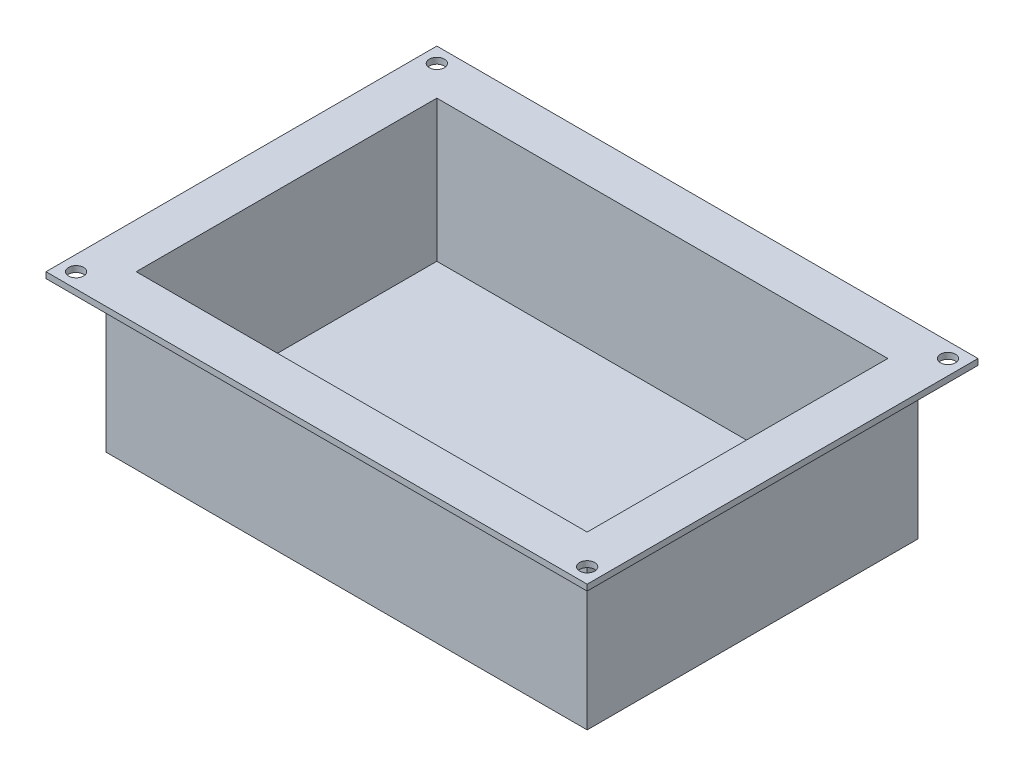
ISO-10303-21;
HEADER;
FILE_DESCRIPTION(('STEP AP214'),'2;1');
FILE_NAME('part.step','',(''),(''),'','','');
FILE_SCHEMA(('AUTOMOTIVE_DESIGN { 1 0 10303 214 1 1 1 1 }'));
ENDSEC;
DATA;
#1=APPLICATION_CONTEXT('core data for automotive mechanical design processes');
#2=APPLICATION_PROTOCOL_DEFINITION('international standard','automotive_design',2000,#1);
#3=PRODUCT_CONTEXT('',#1,'mechanical');
#4=PRODUCT('Part','Part','',(#3));
#5=PRODUCT_RELATED_PRODUCT_CATEGORY('part','',(#4));
#6=PRODUCT_DEFINITION_FORMATION('','',#4);
#7=PRODUCT_DEFINITION_CONTEXT('part definition',#1,'design');
#8=PRODUCT_DEFINITION('design','',#6,#7);
#9=PRODUCT_DEFINITION_SHAPE('','',#8);
#10=(LENGTH_UNIT() NAMED_UNIT(*) SI_UNIT(.MILLI.,.METRE.));
#11=(NAMED_UNIT(*) PLANE_ANGLE_UNIT() SI_UNIT($,.RADIAN.));
#12=(NAMED_UNIT(*) SI_UNIT($,.STERADIAN.) SOLID_ANGLE_UNIT());
#13=UNCERTAINTY_MEASURE_WITH_UNIT(LENGTH_MEASURE(1.E-05),#10,'distance_accuracy_value','');
#14=(GEOMETRIC_REPRESENTATION_CONTEXT(3) GLOBAL_UNCERTAINTY_ASSIGNED_CONTEXT((#13)) GLOBAL_UNIT_ASSIGNED_CONTEXT((#10,
#11,#12)) REPRESENTATION_CONTEXT('',''));
#15=CARTESIAN_POINT('',(0.,0.,0.));
#16=DIRECTION('',(0.,0.,1.));
#17=DIRECTION('',(1.,0.,0.));
#18=AXIS2_PLACEMENT_3D('',#15,#16,#17);
#19=CARTESIAN_POINT('',(-101.6,63.5,69.85));
#20=DIRECTION('',(0.,0.,-1.));
#21=DIRECTION('',(-1.,0.,0.));
#22=AXIS2_PLACEMENT_3D('',#19,#20,#21);
#23=PLANE('',#22);
#24=DIRECTION('',(1.,0.,0.));
#25=VECTOR('',#24,1.);
#26=CARTESIAN_POINT('',(-101.6,0.,69.85));
#27=LINE('',#26,#25);
#28=CARTESIAN_POINT('',(-101.6,0.,69.85));
#29=VERTEX_POINT('',#28);
#30=CARTESIAN_POINT('',(101.6,0.,69.85));
#31=VERTEX_POINT('',#30);
#32=EDGE_CURVE('E223',#29,#31,#27,.T.);
#33=ORIENTED_EDGE('',*,*,#32,.T.);
#34=DIRECTION('',(0.,-1.,0.));
#35=VECTOR('',#34,1.);
#36=CARTESIAN_POINT('',(101.6,63.5,69.85));
#37=LINE('',#36,#35);
#38=CARTESIAN_POINT('',(101.6,63.5,69.85));
#39=VERTEX_POINT('',#38);
#40=EDGE_CURVE('E12',#39,#31,#37,.T.);
#41=ORIENTED_EDGE('',*,*,#40,.F.);
#42=DIRECTION('',(1.,0.,0.));
#43=VECTOR('',#42,1.);
#44=CARTESIAN_POINT('',(-101.6,63.5,69.85));
#45=LINE('',#44,#43);
#46=CARTESIAN_POINT('',(-101.6,63.5,69.85));
#47=VERTEX_POINT('',#46);
#48=EDGE_CURVE('E224',#47,#39,#45,.T.);
#49=ORIENTED_EDGE('',*,*,#48,.F.);
#50=DIRECTION('',(0.,-1.,0.));
#51=VECTOR('',#50,1.);
#52=CARTESIAN_POINT('',(-101.6,63.5,69.85));
#53=LINE('',#52,#51);
#54=EDGE_CURVE('E234',#47,#29,#53,.T.);
#55=ORIENTED_EDGE('',*,*,#54,.T.);
#56=EDGE_LOOP('',(#33,#41,#49,#55));
#57=FACE_BOUND('',#56,.T.);
#58=ADVANCED_FACE('F35',(#57),#23,.F.);
#59=CARTESIAN_POINT('',(101.6,63.5,-69.85));
#60=DIRECTION('',(1.,0.,0.));
#61=DIRECTION('',(0.,0.,-1.));
#62=AXIS2_PLACEMENT_3D('',#59,#60,#61);
#63=PLANE('',#62);
#64=DIRECTION('',(0.,0.,1.));
#65=VECTOR('',#64,1.);
#66=CARTESIAN_POINT('',(101.6,0.,-69.85));
#67=LINE('',#66,#65);
#68=CARTESIAN_POINT('',(101.6,0.,-69.85));
#69=VERTEX_POINT('',#68);
#70=EDGE_CURVE('E236',#69,#31,#67,.T.);
#71=ORIENTED_EDGE('',*,*,#70,.F.);
#72=DIRECTION('',(0.,-1.,0.));
#73=VECTOR('',#72,1.);
#74=CARTESIAN_POINT('',(101.6,63.5,-69.85));
#75=LINE('',#74,#73);
#76=CARTESIAN_POINT('',(101.6,63.5,-69.85));
#77=VERTEX_POINT('',#76);
#78=EDGE_CURVE('E42',#77,#69,#75,.T.);
#79=ORIENTED_EDGE('',*,*,#78,.F.);
#80=DIRECTION('',(0.,0.,1.));
#81=VECTOR('',#80,1.);
#82=CARTESIAN_POINT('',(101.6,63.5,-69.85));
#83=LINE('',#82,#81);
#84=EDGE_CURVE('E227',#77,#39,#83,.T.);
#85=ORIENTED_EDGE('',*,*,#84,.T.);
#86=ORIENTED_EDGE('',*,*,#40,.T.);
#87=EDGE_LOOP('',(#71,#79,#85,#86));
#88=FACE_BOUND('',#87,.T.);
#89=ADVANCED_FACE('F249',(#88),#63,.T.);
#90=CARTESIAN_POINT('',(-101.6,63.5,-69.85));
#91=DIRECTION('',(0.,0.,-1.));
#92=DIRECTION('',(-1.,0.,0.));
#93=AXIS2_PLACEMENT_3D('',#90,#91,#92);
#94=PLANE('',#93);
#95=DIRECTION('',(1.,0.,0.));
#96=VECTOR('',#95,1.);
#97=CARTESIAN_POINT('',(-101.6,0.,-69.85));
#98=LINE('',#97,#96);
#99=CARTESIAN_POINT('',(-101.6,0.,-69.85));
#100=VERTEX_POINT('',#99);
#101=EDGE_CURVE('E239',#100,#69,#98,.T.);
#102=ORIENTED_EDGE('',*,*,#101,.F.);
#103=DIRECTION('',(0.,-1.,0.));
#104=VECTOR('',#103,1.);
#105=CARTESIAN_POINT('',(-101.6,63.5,-69.85));
#106=LINE('',#105,#104);
#107=CARTESIAN_POINT('',(-101.6,63.5,-69.85));
#108=VERTEX_POINT('',#107);
#109=EDGE_CURVE('E58',#108,#100,#106,.T.);
#110=ORIENTED_EDGE('',*,*,#109,.F.);
#111=DIRECTION('',(1.,0.,0.));
#112=VECTOR('',#111,1.);
#113=CARTESIAN_POINT('',(-101.6,63.5,-69.85));
#114=LINE('',#113,#112);
#115=EDGE_CURVE('E229',#108,#77,#114,.T.);
#116=ORIENTED_EDGE('',*,*,#115,.T.);
#117=ORIENTED_EDGE('',*,*,#78,.T.);
#118=EDGE_LOOP('',(#102,#110,#116,#117));
#119=FACE_BOUND('',#118,.T.);
#120=ADVANCED_FACE('F245',(#119),#94,.T.);
#121=CARTESIAN_POINT('',(-101.6,63.5,-69.85));
#122=DIRECTION('',(1.,0.,0.));
#123=DIRECTION('',(0.,0.,-1.));
#124=AXIS2_PLACEMENT_3D('',#121,#122,#123);
#125=PLANE('',#124);
#126=DIRECTION('',(0.,0.,1.));
#127=VECTOR('',#126,1.);
#128=CARTESIAN_POINT('',(-101.6,0.,-69.85));
#129=LINE('',#128,#127);
#130=EDGE_CURVE('E77',#100,#29,#129,.T.);
#131=ORIENTED_EDGE('',*,*,#130,.T.);
#132=ORIENTED_EDGE('',*,*,#54,.F.);
#133=DIRECTION('',(0.,0.,1.));
#134=VECTOR('',#133,1.);
#135=CARTESIAN_POINT('',(-101.6,63.5,-69.85));
#136=LINE('',#135,#134);
#137=EDGE_CURVE('E231',#108,#47,#136,.T.);
#138=ORIENTED_EDGE('',*,*,#137,.F.);
#139=ORIENTED_EDGE('',*,*,#109,.T.);
#140=EDGE_LOOP('',(#131,#132,#138,#139));
#141=FACE_BOUND('',#140,.T.);
#142=ADVANCED_FACE('F253',(#141),#125,.F.);
#143=CARTESIAN_POINT('',(0.,0.,0.));
#144=DIRECTION('',(0.,-1.,0.));
#145=DIRECTION('',(0.,0.,-1.));
#146=AXIS2_PLACEMENT_3D('',#143,#144,#145);
#147=PLANE('',#146);
#148=ORIENTED_EDGE('',*,*,#32,.F.);
#149=ORIENTED_EDGE('',*,*,#130,.F.);
#150=ORIENTED_EDGE('',*,*,#101,.T.);
#151=ORIENTED_EDGE('',*,*,#70,.T.);
#152=EDGE_LOOP('',(#148,#149,#150,#151));
#153=FACE_BOUND('',#152,.T.);
#154=ADVANCED_FACE('F252',(#153),#147,.T.);
#155=CARTESIAN_POINT('',(0.,63.5,0.));
#156=DIRECTION('',(0.,1.,0.));
#157=DIRECTION('',(0.,0.,1.));
#158=AXIS2_PLACEMENT_3D('',#155,#156,#157);
#159=PLANE('',#158);
#160=CARTESIAN_POINT('',(107.95,63.5,-76.2));
#161=DIRECTION('',(0.,-1.,0.));
#162=DIRECTION('',(0.,0.,-1.));
#163=AXIS2_PLACEMENT_3D('',#160,#161,#162);
#164=CIRCLE('',#163,3.175);
#165=CARTESIAN_POINT('',(107.95,63.5,-79.375));
#166=VERTEX_POINT('',#165);
#167=EDGE_CURVE('E169',#166,#166,#164,.T.);
#168=ORIENTED_EDGE('',*,*,#167,.F.);
#169=EDGE_LOOP('',(#168));
#170=FACE_BOUND('',#169,.T.);
#171=CARTESIAN_POINT('',(107.95,63.5,76.2));
#172=DIRECTION('',(0.,-1.,0.));
#173=DIRECTION('',(0.,0.,-1.));
#174=AXIS2_PLACEMENT_3D('',#171,#172,#173);
#175=CIRCLE('',#174,3.175);
#176=CARTESIAN_POINT('',(107.95,63.5,73.025));
#177=VERTEX_POINT('',#176);
#178=EDGE_CURVE('E175',#177,#177,#175,.T.);
#179=ORIENTED_EDGE('',*,*,#178,.F.);
#180=EDGE_LOOP('',(#179));
#181=FACE_BOUND('',#180,.T.);
#182=CARTESIAN_POINT('',(-107.95,63.5,-76.2));
#183=DIRECTION('',(0.,-1.,0.));
#184=DIRECTION('',(0.,0.,-1.));
#185=AXIS2_PLACEMENT_3D('',#182,#183,#184);
#186=CIRCLE('',#185,3.175);
#187=CARTESIAN_POINT('',(-107.95,63.5,-79.375));
#188=VERTEX_POINT('',#187);
#189=EDGE_CURVE('E181',#188,#188,#186,.T.);
#190=ORIENTED_EDGE('',*,*,#189,.F.);
#191=EDGE_LOOP('',(#190));
#192=FACE_BOUND('',#191,.T.);
#193=CARTESIAN_POINT('',(-107.95,63.5,76.2));
#194=DIRECTION('',(0.,-1.,0.));
#195=DIRECTION('',(0.,0.,-1.));
#196=AXIS2_PLACEMENT_3D('',#193,#194,#195);
#197=CIRCLE('',#196,3.175);
#198=CARTESIAN_POINT('',(-107.95,63.5,73.025));
#199=VERTEX_POINT('',#198);
#200=EDGE_CURVE('E187',#199,#199,#197,.T.);
#201=ORIENTED_EDGE('',*,*,#200,.F.);
#202=EDGE_LOOP('',(#201));
#203=FACE_BOUND('',#202,.T.);
#204=DIRECTION('',(0.,0.,1.));
#205=VECTOR('',#204,1.);
#206=CARTESIAN_POINT('',(-114.3,63.5,-82.55));
#207=LINE('',#206,#205);
#208=CARTESIAN_POINT('',(-114.3,63.5,-82.55));
#209=VERTEX_POINT('',#208);
#210=CARTESIAN_POINT('',(-114.3,63.5,82.55));
#211=VERTEX_POINT('',#210);
#212=EDGE_CURVE('E193',#209,#211,#207,.T.);
#213=ORIENTED_EDGE('',*,*,#212,.F.);
#214=DIRECTION('',(-1.,0.,0.));
#215=VECTOR('',#214,1.);
#216=CARTESIAN_POINT('',(114.3,63.5,-82.55));
#217=LINE('',#216,#215);
#218=CARTESIAN_POINT('',(114.3,63.5,-82.55));
#219=VERTEX_POINT('',#218);
#220=EDGE_CURVE('E198',#219,#209,#217,.T.);
#221=ORIENTED_EDGE('',*,*,#220,.F.);
#222=DIRECTION('',(0.,0.,-1.));
#223=VECTOR('',#222,1.);
#224=CARTESIAN_POINT('',(114.3,63.5,82.55));
#225=LINE('',#224,#223);
#226=CARTESIAN_POINT('',(114.3,63.5,82.55));
#227=VERTEX_POINT('',#226);
#228=EDGE_CURVE('E209',#227,#219,#225,.T.);
#229=ORIENTED_EDGE('',*,*,#228,.F.);
#230=DIRECTION('',(1.,0.,0.));
#231=VECTOR('',#230,1.);
#232=CARTESIAN_POINT('',(-114.3,63.5,82.55));
#233=LINE('',#232,#231);
#234=EDGE_CURVE('E207',#211,#227,#233,.T.);
#235=ORIENTED_EDGE('',*,*,#234,.F.);
#236=EDGE_LOOP('',(#213,#221,#229,#235));
#237=FACE_BOUND('',#236,.T.);
#238=ORIENTED_EDGE('',*,*,#137,.T.);
#239=ORIENTED_EDGE('',*,*,#48,.T.);
#240=ORIENTED_EDGE('',*,*,#84,.F.);
#241=ORIENTED_EDGE('',*,*,#115,.F.);
#242=EDGE_LOOP('',(#238,#239,#240,#241));
#243=FACE_BOUND('',#242,.T.);
#244=ADVANCED_FACE('F255',(#170,#181,#192,#203,#237,#243),#159,.F.);
#245=CARTESIAN_POINT('',(-114.3,66.04,-82.55));
#246=DIRECTION('',(1.,0.,0.));
#247=DIRECTION('',(0.,0.,-1.));
#248=AXIS2_PLACEMENT_3D('',#245,#246,#247);
#249=PLANE('',#248);
#250=ORIENTED_EDGE('',*,*,#212,.T.);
#251=DIRECTION('',(0.,-1.,0.));
#252=VECTOR('',#251,1.);
#253=CARTESIAN_POINT('',(-114.3,66.04,82.55));
#254=LINE('',#253,#252);
#255=CARTESIAN_POINT('',(-114.3,66.04,82.55));
#256=VERTEX_POINT('',#255);
#257=EDGE_CURVE('E220',#256,#211,#254,.T.);
#258=ORIENTED_EDGE('',*,*,#257,.F.);
#259=DIRECTION('',(0.,0.,1.));
#260=VECTOR('',#259,1.);
#261=CARTESIAN_POINT('',(-114.3,66.04,-82.55));
#262=LINE('',#261,#260);
#263=CARTESIAN_POINT('',(-114.3,66.04,-82.55));
#264=VERTEX_POINT('',#263);
#265=EDGE_CURVE('E194',#264,#256,#262,.T.);
#266=ORIENTED_EDGE('',*,*,#265,.F.);
#267=DIRECTION('',(0.,-1.,0.));
#268=VECTOR('',#267,1.);
#269=CARTESIAN_POINT('',(-114.3,66.04,-82.55));
#270=LINE('',#269,#268);
#271=EDGE_CURVE('E204',#264,#209,#270,.T.);
#272=ORIENTED_EDGE('',*,*,#271,.T.);
#273=EDGE_LOOP('',(#250,#258,#266,#272));
#274=FACE_BOUND('',#273,.T.);
#275=ADVANCED_FACE('F257',(#274),#249,.F.);
#276=CARTESIAN_POINT('',(-114.3,66.04,82.55));
#277=DIRECTION('',(0.,0.,-1.));
#278=DIRECTION('',(-1.,0.,0.));
#279=AXIS2_PLACEMENT_3D('',#276,#277,#278);
#280=PLANE('',#279);
#281=ORIENTED_EDGE('',*,*,#234,.T.);
#282=DIRECTION('',(0.,-1.,0.));
#283=VECTOR('',#282,1.);
#284=CARTESIAN_POINT('',(114.3,66.04,82.55));
#285=LINE('',#284,#283);
#286=CARTESIAN_POINT('',(114.3,66.04,82.55));
#287=VERTEX_POINT('',#286);
#288=EDGE_CURVE('E217',#287,#227,#285,.T.);
#289=ORIENTED_EDGE('',*,*,#288,.F.);
#290=DIRECTION('',(1.,0.,0.));
#291=VECTOR('',#290,1.);
#292=CARTESIAN_POINT('',(-114.3,66.04,82.55));
#293=LINE('',#292,#291);
#294=EDGE_CURVE('E197',#256,#287,#293,.T.);
#295=ORIENTED_EDGE('',*,*,#294,.F.);
#296=ORIENTED_EDGE('',*,*,#257,.T.);
#297=EDGE_LOOP('',(#281,#289,#295,#296));
#298=FACE_BOUND('',#297,.T.);
#299=ADVANCED_FACE('F264',(#298),#280,.F.);
#300=CARTESIAN_POINT('',(114.3,66.04,82.55));
#301=DIRECTION('',(-1.,0.,0.));
#302=DIRECTION('',(0.,0.,1.));
#303=AXIS2_PLACEMENT_3D('',#300,#301,#302);
#304=PLANE('',#303);
#305=ORIENTED_EDGE('',*,*,#228,.T.);
#306=DIRECTION('',(0.,-1.,0.));
#307=VECTOR('',#306,1.);
#308=CARTESIAN_POINT('',(114.3,66.04,-82.55));
#309=LINE('',#308,#307);
#310=CARTESIAN_POINT('',(114.3,66.04,-82.55));
#311=VERTEX_POINT('',#310);
#312=EDGE_CURVE('E214',#311,#219,#309,.T.);
#313=ORIENTED_EDGE('',*,*,#312,.F.);
#314=DIRECTION('',(0.,0.,-1.));
#315=VECTOR('',#314,1.);
#316=CARTESIAN_POINT('',(114.3,66.04,82.55));
#317=LINE('',#316,#315);
#318=EDGE_CURVE('E200',#287,#311,#317,.T.);
#319=ORIENTED_EDGE('',*,*,#318,.F.);
#320=ORIENTED_EDGE('',*,*,#288,.T.);
#321=EDGE_LOOP('',(#305,#313,#319,#320));
#322=FACE_BOUND('',#321,.T.);
#323=ADVANCED_FACE('F285',(#322),#304,.F.);
#324=CARTESIAN_POINT('',(114.3,66.04,-82.55));
#325=DIRECTION('',(0.,0.,1.));
#326=DIRECTION('',(1.,0.,0.));
#327=AXIS2_PLACEMENT_3D('',#324,#325,#326);
#328=PLANE('',#327);
#329=ORIENTED_EDGE('',*,*,#220,.T.);
#330=ORIENTED_EDGE('',*,*,#271,.F.);
#331=DIRECTION('',(-1.,0.,0.));
#332=VECTOR('',#331,1.);
#333=CARTESIAN_POINT('',(114.3,66.04,-82.55));
#334=LINE('',#333,#332);
#335=EDGE_CURVE('E202',#311,#264,#334,.T.);
#336=ORIENTED_EDGE('',*,*,#335,.F.);
#337=ORIENTED_EDGE('',*,*,#312,.T.);
#338=EDGE_LOOP('',(#329,#330,#336,#337));
#339=FACE_BOUND('',#338,.T.);
#340=ADVANCED_FACE('F288',(#339),#328,.F.);
#341=CARTESIAN_POINT('',(0.,66.04,0.));
#342=DIRECTION('',(0.,1.,0.));
#343=DIRECTION('',(0.,0.,1.));
#344=AXIS2_PLACEMENT_3D('',#341,#342,#343);
#345=PLANE('',#344);
#346=DIRECTION('',(1.,0.,0.));
#347=VECTOR('',#346,1.);
#348=CARTESIAN_POINT('',(-95.25,66.04,63.5));
#349=LINE('',#348,#347);
#350=CARTESIAN_POINT('',(-95.25,66.04,63.5));
#351=VERTEX_POINT('',#350);
#352=CARTESIAN_POINT('',(95.25,66.04,63.5));
#353=VERTEX_POINT('',#352);
#354=EDGE_CURVE('E148',#351,#353,#349,.T.);
#355=ORIENTED_EDGE('',*,*,#354,.F.);
#356=DIRECTION('',(0.,0.,1.));
#357=VECTOR('',#356,1.);
#358=CARTESIAN_POINT('',(-95.25,66.04,-63.5));
#359=LINE('',#358,#357);
#360=CARTESIAN_POINT('',(-95.25,66.04,-63.5));
#361=VERTEX_POINT('',#360);
#362=EDGE_CURVE('E159',#361,#351,#359,.T.);
#363=ORIENTED_EDGE('',*,*,#362,.F.);
#364=DIRECTION('',(-1.,0.,0.));
#365=VECTOR('',#364,1.);
#366=CARTESIAN_POINT('',(-95.25,66.04,-63.5));
#367=LINE('',#366,#365);
#368=CARTESIAN_POINT('',(95.25,66.04,-63.5));
#369=VERTEX_POINT('',#368);
#370=EDGE_CURVE('E49',#369,#361,#367,.T.);
#371=ORIENTED_EDGE('',*,*,#370,.F.);
#372=DIRECTION('',(0.,0.,-1.));
#373=VECTOR('',#372,1.);
#374=CARTESIAN_POINT('',(95.25,66.04,-63.5));
#375=LINE('',#374,#373);
#376=EDGE_CURVE('E155',#353,#369,#375,.T.);
#377=ORIENTED_EDGE('',*,*,#376,.F.);
#378=EDGE_LOOP('',(#355,#363,#371,#377));
#379=FACE_BOUND('',#378,.T.);
#380=CARTESIAN_POINT('',(107.95,66.04,-76.2));
#381=DIRECTION('',(0.,-1.,0.));
#382=DIRECTION('',(0.,0.,-1.));
#383=AXIS2_PLACEMENT_3D('',#380,#381,#382);
#384=CIRCLE('',#383,3.175);
#385=CARTESIAN_POINT('',(107.95,66.04,-79.375));
#386=VERTEX_POINT('',#385);
#387=EDGE_CURVE('E172',#386,#386,#384,.T.);
#388=ORIENTED_EDGE('',*,*,#387,.T.);
#389=EDGE_LOOP('',(#388));
#390=FACE_BOUND('',#389,.T.);
#391=CARTESIAN_POINT('',(107.95,66.04,76.2));
#392=DIRECTION('',(0.,-1.,0.));
#393=DIRECTION('',(0.,0.,-1.));
#394=AXIS2_PLACEMENT_3D('',#391,#392,#393);
#395=CIRCLE('',#394,3.175);
#396=CARTESIAN_POINT('',(107.95,66.04,73.025));
#397=VERTEX_POINT('',#396);
#398=EDGE_CURVE('E178',#397,#397,#395,.T.);
#399=ORIENTED_EDGE('',*,*,#398,.T.);
#400=EDGE_LOOP('',(#399));
#401=FACE_BOUND('',#400,.T.);
#402=CARTESIAN_POINT('',(-107.95,66.04,-76.2));
#403=DIRECTION('',(0.,-1.,0.));
#404=DIRECTION('',(0.,0.,-1.));
#405=AXIS2_PLACEMENT_3D('',#402,#403,#404);
#406=CIRCLE('',#405,3.175);
#407=CARTESIAN_POINT('',(-107.95,66.04,-79.375));
#408=VERTEX_POINT('',#407);
#409=EDGE_CURVE('E184',#408,#408,#406,.T.);
#410=ORIENTED_EDGE('',*,*,#409,.T.);
#411=EDGE_LOOP('',(#410));
#412=FACE_BOUND('',#411,.T.);
#413=CARTESIAN_POINT('',(-107.95,66.04,76.2));
#414=DIRECTION('',(0.,-1.,0.));
#415=DIRECTION('',(0.,0.,-1.));
#416=AXIS2_PLACEMENT_3D('',#413,#414,#415);
#417=CIRCLE('',#416,3.175);
#418=CARTESIAN_POINT('',(-107.95,66.04,73.025));
#419=VERTEX_POINT('',#418);
#420=EDGE_CURVE('E190',#419,#419,#417,.T.);
#421=ORIENTED_EDGE('',*,*,#420,.T.);
#422=EDGE_LOOP('',(#421));
#423=FACE_BOUND('',#422,.T.);
#424=ORIENTED_EDGE('',*,*,#265,.T.);
#425=ORIENTED_EDGE('',*,*,#294,.T.);
#426=ORIENTED_EDGE('',*,*,#318,.T.);
#427=ORIENTED_EDGE('',*,*,#335,.T.);
#428=EDGE_LOOP('',(#424,#425,#426,#427));
#429=FACE_BOUND('',#428,.T.);
#430=ADVANCED_FACE('F291',(#379,#390,#401,#412,#423,#429),#345,.T.);
#431=CARTESIAN_POINT('',(-107.95,63.5,76.2));
#432=DIRECTION('',(0.,-1.,0.));
#433=DIRECTION('',(0.,0.,-1.));
#434=AXIS2_PLACEMENT_3D('',#431,#432,#433);
#435=CYLINDRICAL_SURFACE('',#434,3.175);
#436=ORIENTED_EDGE('',*,*,#420,.F.);
#437=EDGE_LOOP('',(#436));
#438=FACE_BOUND('',#437,.T.);
#439=ORIENTED_EDGE('',*,*,#200,.T.);
#440=EDGE_LOOP('',(#439));
#441=FACE_BOUND('',#440,.T.);
#442=ADVANCED_FACE('F296',(#438,#441),#435,.F.);
#443=CARTESIAN_POINT('',(-107.95,63.5,-76.2));
#444=DIRECTION('',(0.,-1.,0.));
#445=DIRECTION('',(0.,0.,-1.));
#446=AXIS2_PLACEMENT_3D('',#443,#444,#445);
#447=CYLINDRICAL_SURFACE('',#446,3.175);
#448=ORIENTED_EDGE('',*,*,#409,.F.);
#449=EDGE_LOOP('',(#448));
#450=FACE_BOUND('',#449,.T.);
#451=ORIENTED_EDGE('',*,*,#189,.T.);
#452=EDGE_LOOP('',(#451));
#453=FACE_BOUND('',#452,.T.);
#454=ADVANCED_FACE('F313',(#450,#453),#447,.F.);
#455=CARTESIAN_POINT('',(107.95,63.5,76.2));
#456=DIRECTION('',(0.,-1.,0.));
#457=DIRECTION('',(0.,0.,-1.));
#458=AXIS2_PLACEMENT_3D('',#455,#456,#457);
#459=CYLINDRICAL_SURFACE('',#458,3.175);
#460=ORIENTED_EDGE('',*,*,#398,.F.);
#461=EDGE_LOOP('',(#460));
#462=FACE_BOUND('',#461,.T.);
#463=ORIENTED_EDGE('',*,*,#178,.T.);
#464=EDGE_LOOP('',(#463));
#465=FACE_BOUND('',#464,.T.);
#466=ADVANCED_FACE('F320',(#462,#465),#459,.F.);
#467=CARTESIAN_POINT('',(107.95,63.5,-76.2));
#468=DIRECTION('',(0.,-1.,0.));
#469=DIRECTION('',(0.,0.,-1.));
#470=AXIS2_PLACEMENT_3D('',#467,#468,#469);
#471=CYLINDRICAL_SURFACE('',#470,3.175);
#472=ORIENTED_EDGE('',*,*,#387,.F.);
#473=EDGE_LOOP('',(#472));
#474=FACE_BOUND('',#473,.T.);
#475=ORIENTED_EDGE('',*,*,#167,.T.);
#476=EDGE_LOOP('',(#475));
#477=FACE_BOUND('',#476,.T.);
#478=ADVANCED_FACE('F324',(#474,#477),#471,.F.);
#479=CARTESIAN_POINT('',(0.,6.35,0.));
#480=DIRECTION('',(0.,-1.,0.));
#481=DIRECTION('',(0.,0.,-1.));
#482=AXIS2_PLACEMENT_3D('',#479,#480,#481);
#483=PLANE('',#482);
#484=DIRECTION('',(0.,0.,1.));
#485=VECTOR('',#484,1.);
#486=CARTESIAN_POINT('',(-95.25,6.34999999999999,-63.5));
#487=LINE('',#486,#485);
#488=CARTESIAN_POINT('',(-95.25,6.34999999999999,-63.5));
#489=VERTEX_POINT('',#488);
#490=CARTESIAN_POINT('',(-95.25,6.34999999999999,63.5));
#491=VERTEX_POINT('',#490);
#492=EDGE_CURVE('E152',#489,#491,#487,.T.);
#493=ORIENTED_EDGE('',*,*,#492,.T.);
#494=DIRECTION('',(1.,0.,0.));
#495=VECTOR('',#494,1.);
#496=CARTESIAN_POINT('',(-95.25,6.34999999999999,63.5));
#497=LINE('',#496,#495);
#498=CARTESIAN_POINT('',(95.25,6.34999999999999,63.5));
#499=VERTEX_POINT('',#498);
#500=EDGE_CURVE('E145',#491,#499,#497,.T.);
#501=ORIENTED_EDGE('',*,*,#500,.T.);
#502=DIRECTION('',(0.,0.,-1.));
#503=VECTOR('',#502,1.);
#504=CARTESIAN_POINT('',(95.25,6.34999999999999,-63.5));
#505=LINE('',#504,#503);
#506=CARTESIAN_POINT('',(95.25,6.34999999999999,-63.5));
#507=VERTEX_POINT('',#506);
#508=EDGE_CURVE('E132',#499,#507,#505,.T.);
#509=ORIENTED_EDGE('',*,*,#508,.T.);
#510=DIRECTION('',(-1.,0.,0.));
#511=VECTOR('',#510,1.);
#512=CARTESIAN_POINT('',(-95.25,6.34999999999999,-63.5));
#513=LINE('',#512,#511);
#514=EDGE_CURVE('E164',#507,#489,#513,.T.);
#515=ORIENTED_EDGE('',*,*,#514,.T.);
#516=EDGE_LOOP('',(#493,#501,#509,#515));
#517=FACE_BOUND('',#516,.T.);
#518=ADVANCED_FACE('F151',(#517),#483,.F.);
#519=CARTESIAN_POINT('',(-95.25,-228.952505991963,63.5));
#520=DIRECTION('',(0.,0.,1.));
#521=DIRECTION('',(1.,0.,0.));
#522=AXIS2_PLACEMENT_3D('',#519,#520,#521);
#523=PLANE('',#522);
#524=DIRECTION('',(0.,1.,0.));
#525=VECTOR('',#524,1.);
#526=CARTESIAN_POINT('',(-95.25,-228.952505991963,63.5));
#527=LINE('',#526,#525);
#528=EDGE_CURVE('E162',#491,#351,#527,.T.);
#529=ORIENTED_EDGE('',*,*,#528,.T.);
#530=ORIENTED_EDGE('',*,*,#354,.T.);
#531=DIRECTION('',(0.,1.,0.));
#532=VECTOR('',#531,1.);
#533=CARTESIAN_POINT('',(95.25,-228.952505991963,63.5));
#534=LINE('',#533,#532);
#535=EDGE_CURVE('E136',#499,#353,#534,.T.);
#536=ORIENTED_EDGE('',*,*,#535,.F.);
#537=ORIENTED_EDGE('',*,*,#500,.F.);
#538=EDGE_LOOP('',(#529,#530,#536,#537));
#539=FACE_BOUND('',#538,.T.);
#540=ADVANCED_FACE('F144',(#539),#523,.F.);
#541=CARTESIAN_POINT('',(95.25,-228.952505991963,-63.5));
#542=DIRECTION('',(1.,0.,0.));
#543=DIRECTION('',(0.,0.,-1.));
#544=AXIS2_PLACEMENT_3D('',#541,#542,#543);
#545=PLANE('',#544);
#546=ORIENTED_EDGE('',*,*,#535,.T.);
#547=ORIENTED_EDGE('',*,*,#376,.T.);
#548=DIRECTION('',(0.,1.,0.));
#549=VECTOR('',#548,1.);
#550=CARTESIAN_POINT('',(95.25,-228.952505991963,-63.5));
#551=LINE('',#550,#549);
#552=EDGE_CURVE('E138',#507,#369,#551,.T.);
#553=ORIENTED_EDGE('',*,*,#552,.F.);
#554=ORIENTED_EDGE('',*,*,#508,.F.);
#555=EDGE_LOOP('',(#546,#547,#553,#554));
#556=FACE_BOUND('',#555,.T.);
#557=ADVANCED_FACE('F134',(#556),#545,.F.);
#558=CARTESIAN_POINT('',(-95.25,-228.952505991963,-63.5));
#559=DIRECTION('',(0.,0.,-1.));
#560=DIRECTION('',(-1.,0.,0.));
#561=AXIS2_PLACEMENT_3D('',#558,#559,#560);
#562=PLANE('',#561);
#563=ORIENTED_EDGE('',*,*,#552,.T.);
#564=ORIENTED_EDGE('',*,*,#370,.T.);
#565=DIRECTION('',(0.,1.,0.));
#566=VECTOR('',#565,1.);
#567=CARTESIAN_POINT('',(-95.25,-228.952505991963,-63.5));
#568=LINE('',#567,#566);
#569=EDGE_CURVE('E163',#489,#361,#568,.T.);
#570=ORIENTED_EDGE('',*,*,#569,.F.);
#571=ORIENTED_EDGE('',*,*,#514,.F.);
#572=EDGE_LOOP('',(#563,#564,#570,#571));
#573=FACE_BOUND('',#572,.T.);
#574=ADVANCED_FACE('F335',(#573),#562,.F.);
#575=CARTESIAN_POINT('',(-95.25,-228.952505991963,-63.5));
#576=DIRECTION('',(-1.,0.,0.));
#577=DIRECTION('',(0.,0.,1.));
#578=AXIS2_PLACEMENT_3D('',#575,#576,#577);
#579=PLANE('',#578);
#580=ORIENTED_EDGE('',*,*,#569,.T.);
#581=ORIENTED_EDGE('',*,*,#362,.T.);
#582=ORIENTED_EDGE('',*,*,#528,.F.);
#583=ORIENTED_EDGE('',*,*,#492,.F.);
#584=EDGE_LOOP('',(#580,#581,#582,#583));
#585=FACE_BOUND('',#584,.T.);
#586=ADVANCED_FACE('F338',(#585),#579,.F.);
#587=CLOSED_SHELL('',(#58,#89,#120,#142,#154,#244,#275,#299,#323,#340,#430,#442,#454,#466,#478,
#518,#540,#557,#574,#586));
#588=MANIFOLD_SOLID_BREP('B2',#587);
#589=ADVANCED_BREP_SHAPE_REPRESENTATION('',(#18,#588),#14);
#590=SHAPE_DEFINITION_REPRESENTATION(#9,#589);
ENDSEC;
END-ISO-10303-21;
